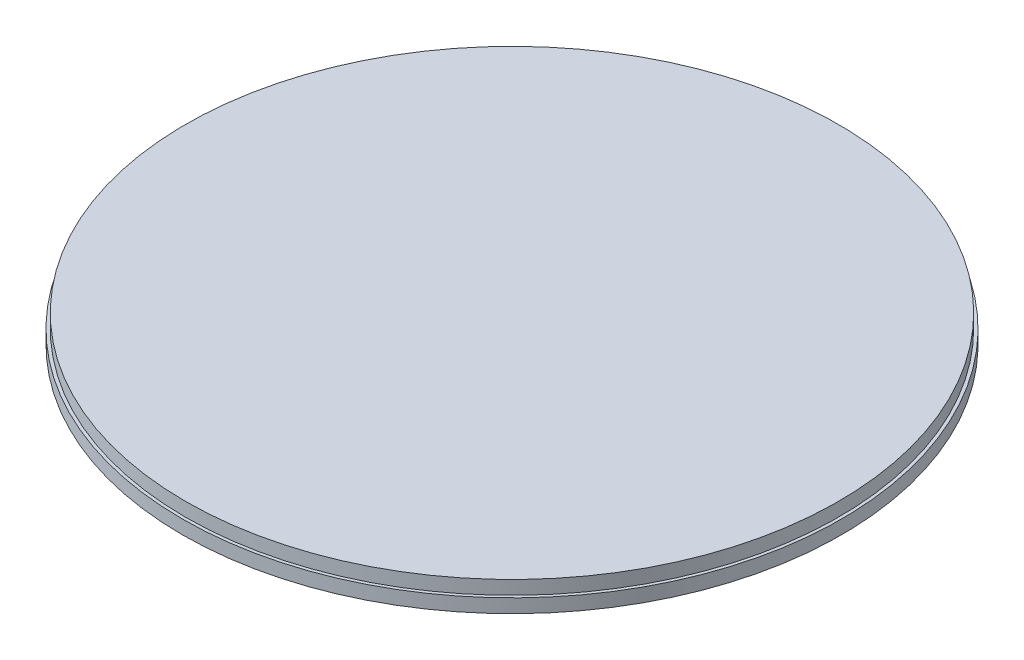
ISO-10303-21;
HEADER;
FILE_DESCRIPTION(('STEP AP214'),'2;1');
FILE_NAME('part.step','',(''),(''),'','','');
FILE_SCHEMA(('AUTOMOTIVE_DESIGN { 1 0 10303 214 1 1 1 1 }'));
ENDSEC;
DATA;
#1=APPLICATION_CONTEXT('core data for automotive mechanical design processes');
#2=APPLICATION_PROTOCOL_DEFINITION('international standard','automotive_design',2000,#1);
#3=PRODUCT_CONTEXT('',#1,'mechanical');
#4=PRODUCT('Part','Part','',(#3));
#5=PRODUCT_RELATED_PRODUCT_CATEGORY('part','',(#4));
#6=PRODUCT_DEFINITION_FORMATION('','',#4);
#7=PRODUCT_DEFINITION_CONTEXT('part definition',#1,'design');
#8=PRODUCT_DEFINITION('design','',#6,#7);
#9=PRODUCT_DEFINITION_SHAPE('','',#8);
#10=(LENGTH_UNIT() NAMED_UNIT(*) SI_UNIT(.MILLI.,.METRE.));
#11=(NAMED_UNIT(*) PLANE_ANGLE_UNIT() SI_UNIT($,.RADIAN.));
#12=(NAMED_UNIT(*) SI_UNIT($,.STERADIAN.) SOLID_ANGLE_UNIT());
#13=UNCERTAINTY_MEASURE_WITH_UNIT(LENGTH_MEASURE(1.E-05),#10,'distance_accuracy_value','');
#14=(GEOMETRIC_REPRESENTATION_CONTEXT(3) GLOBAL_UNCERTAINTY_ASSIGNED_CONTEXT((#13)) GLOBAL_UNIT_ASSIGNED_CONTEXT((#10,
#11,#12)) REPRESENTATION_CONTEXT('',''));
#15=CARTESIAN_POINT('',(0.,0.,0.));
#16=DIRECTION('',(0.,0.,1.));
#17=DIRECTION('',(1.,0.,0.));
#18=AXIS2_PLACEMENT_3D('',#15,#16,#17);
#19=CARTESIAN_POINT('',(0.,3.175,0.));
#20=DIRECTION('',(0.,-1.,0.));
#21=DIRECTION('',(0.,0.,-1.));
#22=AXIS2_PLACEMENT_3D('',#19,#20,#21);
#23=CYLINDRICAL_SURFACE('',#22,76.2);
#24=CARTESIAN_POINT('',(0.,3.175,0.));
#25=DIRECTION('',(0.,1.,0.));
#26=DIRECTION('',(0.,0.,1.));
#27=AXIS2_PLACEMENT_3D('',#24,#25,#26);
#28=CIRCLE('',#27,76.2);
#29=CARTESIAN_POINT('',(0.,3.175,76.2));
#30=VERTEX_POINT('',#29);
#31=EDGE_CURVE('E38',#30,#30,#28,.T.);
#32=ORIENTED_EDGE('',*,*,#31,.F.);
#33=EDGE_LOOP('',(#32));
#34=FACE_BOUND('',#33,.T.);
#35=CARTESIAN_POINT('',(0.,0.,0.));
#36=DIRECTION('',(0.,1.,0.));
#37=DIRECTION('',(0.,0.,1.));
#38=AXIS2_PLACEMENT_3D('',#35,#36,#37);
#39=CIRCLE('',#38,76.2);
#40=CARTESIAN_POINT('',(0.,0.,76.2));
#41=VERTEX_POINT('',#40);
#42=EDGE_CURVE('E34',#41,#41,#39,.T.);
#43=ORIENTED_EDGE('',*,*,#42,.T.);
#44=EDGE_LOOP('',(#43));
#45=FACE_BOUND('',#44,.T.);
#46=ADVANCED_FACE('F31',(#34,#45),#23,.T.);
#47=CARTESIAN_POINT('',(0.,3.175,0.));
#48=DIRECTION('',(0.,1.,0.));
#49=DIRECTION('',(0.,0.,1.));
#50=AXIS2_PLACEMENT_3D('',#47,#48,#49);
#51=PLANE('',#50);
#52=CARTESIAN_POINT('',(0.,3.175,0.));
#53=DIRECTION('',(0.,1.,0.));
#54=DIRECTION('',(0.,0.,1.));
#55=AXIS2_PLACEMENT_3D('',#52,#53,#54);
#56=CIRCLE('',#55,75.4888);
#57=CARTESIAN_POINT('',(0.,3.175,75.4888));
#58=VERTEX_POINT('',#57);
#59=EDGE_CURVE('E10',#58,#58,#56,.T.);
#60=ORIENTED_EDGE('',*,*,#59,.F.);
#61=EDGE_LOOP('',(#60));
#62=FACE_BOUND('',#61,.T.);
#63=ORIENTED_EDGE('',*,*,#31,.T.);
#64=EDGE_LOOP('',(#63));
#65=FACE_BOUND('',#64,.T.);
#66=ADVANCED_FACE('F55',(#62,#65),#51,.T.);
#67=CARTESIAN_POINT('',(0.,0.,0.));
#68=DIRECTION('',(0.,1.,0.));
#69=DIRECTION('',(0.,0.,1.));
#70=AXIS2_PLACEMENT_3D('',#67,#68,#69);
#71=PLANE('',#70);
#72=ORIENTED_EDGE('',*,*,#42,.F.);
#73=EDGE_LOOP('',(#72));
#74=FACE_BOUND('',#73,.T.);
#75=ADVANCED_FACE('F52',(#74),#71,.F.);
#76=CARTESIAN_POINT('',(0.,6.35,0.));
#77=DIRECTION('',(0.,-1.,0.));
#78=DIRECTION('',(0.,0.,-1.));
#79=AXIS2_PLACEMENT_3D('',#76,#77,#78);
#80=CYLINDRICAL_SURFACE('',#79,75.4888);
#81=CARTESIAN_POINT('',(0.,6.35,0.));
#82=DIRECTION('',(0.,1.,0.));
#83=DIRECTION('',(0.,0.,1.));
#84=AXIS2_PLACEMENT_3D('',#81,#82,#83);
#85=CIRCLE('',#84,75.4888);
#86=CARTESIAN_POINT('',(0.,6.35,75.4888));
#87=VERTEX_POINT('',#86);
#88=EDGE_CURVE('E44',#87,#87,#85,.T.);
#89=ORIENTED_EDGE('',*,*,#88,.F.);
#90=EDGE_LOOP('',(#89));
#91=FACE_BOUND('',#90,.T.);
#92=ORIENTED_EDGE('',*,*,#59,.T.);
#93=EDGE_LOOP('',(#92));
#94=FACE_BOUND('',#93,.T.);
#95=ADVANCED_FACE('F54',(#91,#94),#80,.T.);
#96=CARTESIAN_POINT('',(0.,6.35,0.));
#97=DIRECTION('',(0.,1.,0.));
#98=DIRECTION('',(0.,0.,1.));
#99=AXIS2_PLACEMENT_3D('',#96,#97,#98);
#100=PLANE('',#99);
#101=ORIENTED_EDGE('',*,*,#88,.T.);
#102=EDGE_LOOP('',(#101));
#103=FACE_BOUND('',#102,.T.);
#104=ADVANCED_FACE('F60',(#103),#100,.T.);
#105=CLOSED_SHELL('',(#46,#66,#75,#95,#104));
#106=MANIFOLD_SOLID_BREP('B2',#105);
#107=ADVANCED_BREP_SHAPE_REPRESENTATION('',(#18,#106),#14);
#108=SHAPE_DEFINITION_REPRESENTATION(#9,#107);
ENDSEC;
END-ISO-10303-21;
